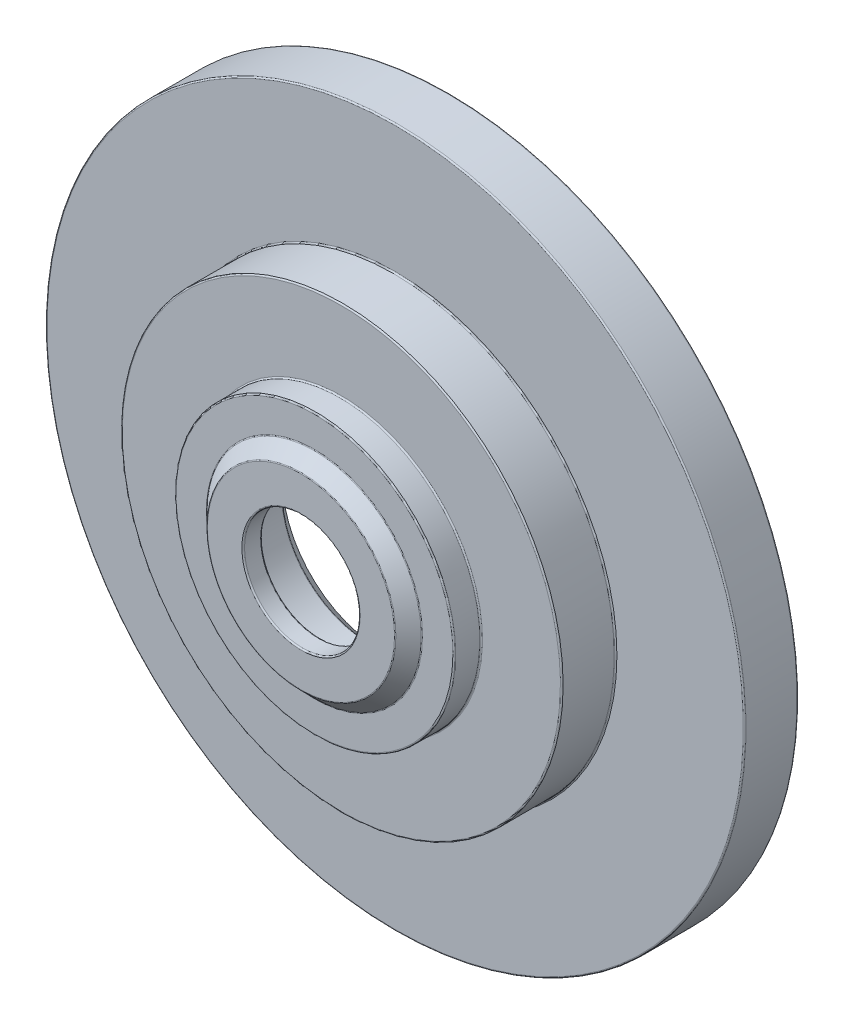
ISO-10303-21;
HEADER;
FILE_DESCRIPTION(('STEP AP214'),'2;1');
FILE_NAME('part.step','',(''),(''),'','','');
FILE_SCHEMA(('AUTOMOTIVE_DESIGN { 1 0 10303 214 1 1 1 1 }'));
ENDSEC;
DATA;
#1=APPLICATION_CONTEXT('core data for automotive mechanical design processes');
#2=APPLICATION_PROTOCOL_DEFINITION('international standard','automotive_design',2000,#1);
#3=PRODUCT_CONTEXT('',#1,'mechanical');
#4=PRODUCT('Part','Part','',(#3));
#5=PRODUCT_RELATED_PRODUCT_CATEGORY('part','',(#4));
#6=PRODUCT_DEFINITION_FORMATION('','',#4);
#7=PRODUCT_DEFINITION_CONTEXT('part definition',#1,'design');
#8=PRODUCT_DEFINITION('design','',#6,#7);
#9=PRODUCT_DEFINITION_SHAPE('','',#8);
#10=(LENGTH_UNIT() NAMED_UNIT(*) SI_UNIT(.MILLI.,.METRE.));
#11=(NAMED_UNIT(*) PLANE_ANGLE_UNIT() SI_UNIT($,.RADIAN.));
#12=(NAMED_UNIT(*) SI_UNIT($,.STERADIAN.) SOLID_ANGLE_UNIT());
#13=UNCERTAINTY_MEASURE_WITH_UNIT(LENGTH_MEASURE(1.E-05),#10,'distance_accuracy_value','');
#14=(GEOMETRIC_REPRESENTATION_CONTEXT(3) GLOBAL_UNCERTAINTY_ASSIGNED_CONTEXT((#13)) GLOBAL_UNIT_ASSIGNED_CONTEXT((#10,
#11,#12)) REPRESENTATION_CONTEXT('',''));
#15=CARTESIAN_POINT('',(0.,0.,0.));
#16=DIRECTION('',(0.,0.,1.));
#17=DIRECTION('',(1.,0.,0.));
#18=AXIS2_PLACEMENT_3D('',#15,#16,#17);
#19=CARTESIAN_POINT('',(0.,0.,-15.));
#20=DIRECTION('',(0.,0.,1.));
#21=DIRECTION('',(1.,0.,0.));
#22=AXIS2_PLACEMENT_3D('',#19,#20,#21);
#23=CYLINDRICAL_SURFACE('',#22,13.75);
#24=CARTESIAN_POINT('',(0.,0.,8.75));
#25=DIRECTION('',(0.,0.,1.));
#26=DIRECTION('',(1.,0.,0.));
#27=AXIS2_PLACEMENT_3D('',#24,#25,#26);
#28=CIRCLE('',#27,13.75);
#29=CARTESIAN_POINT('',(13.75,0.,8.75));
#30=VERTEX_POINT('',#29);
#31=EDGE_CURVE('E66',#30,#30,#28,.T.);
#32=ORIENTED_EDGE('',*,*,#31,.T.);
#33=EDGE_LOOP('',(#32));
#34=FACE_BOUND('',#33,.T.);
#35=CARTESIAN_POINT('',(0.,0.,7.25));
#36=DIRECTION('',(0.,0.,1.));
#37=DIRECTION('',(1.,0.,0.));
#38=AXIS2_PLACEMENT_3D('',#35,#36,#37);
#39=CIRCLE('',#38,13.75);
#40=CARTESIAN_POINT('',(13.75,0.,7.25));
#41=VERTEX_POINT('',#40);
#42=EDGE_CURVE('E69',#41,#41,#39,.F.);
#43=ORIENTED_EDGE('',*,*,#42,.T.);
#44=EDGE_LOOP('',(#43));
#45=FACE_BOUND('',#44,.T.);
#46=ADVANCED_FACE('F43',(#34,#45),#23,.F.);
#47=CARTESIAN_POINT('',(0.,0.,10.));
#48=DIRECTION('',(0.,0.,-1.));
#49=DIRECTION('',(-1.,0.,0.));
#50=AXIS2_PLACEMENT_3D('',#47,#48,#49);
#51=CYLINDRICAL_SURFACE('',#50,16.);
#52=CARTESIAN_POINT('',(0.,0.,6.75));
#53=DIRECTION('',(0.,0.,1.));
#54=DIRECTION('',(1.,0.,0.));
#55=AXIS2_PLACEMENT_3D('',#52,#53,#54);
#56=CIRCLE('',#55,16.);
#57=CARTESIAN_POINT('',(16.,0.,6.75));
#58=VERTEX_POINT('',#57);
#59=EDGE_CURVE('E103',#58,#58,#56,.T.);
#60=ORIENTED_EDGE('',*,*,#59,.T.);
#61=EDGE_LOOP('',(#60));
#62=FACE_BOUND('',#61,.T.);
#63=CARTESIAN_POINT('',(0.,0.,0.103553390593291));
#64=DIRECTION('',(0.,0.,1.));
#65=DIRECTION('',(1.,0.,0.));
#66=AXIS2_PLACEMENT_3D('',#63,#64,#65);
#67=CIRCLE('',#66,16.);
#68=CARTESIAN_POINT('',(16.,0.,0.103553390593291));
#69=VERTEX_POINT('',#68);
#70=EDGE_CURVE('E106',#69,#69,#67,.F.);
#71=ORIENTED_EDGE('',*,*,#70,.T.);
#72=EDGE_LOOP('',(#71));
#73=FACE_BOUND('',#72,.T.);
#74=ADVANCED_FACE('F204',(#62,#73),#51,.F.);
#75=CARTESIAN_POINT('',(0.,0.,10.));
#76=DIRECTION('',(0.,0.,1.));
#77=DIRECTION('',(1.,0.,0.));
#78=AXIS2_PLACEMENT_3D('',#75,#76,#77);
#79=PLANE('',#78);
#80=CARTESIAN_POINT('',(0.,0.,10.));
#81=DIRECTION('',(0.,0.,1.));
#82=DIRECTION('',(1.,0.,0.));
#83=AXIS2_PLACEMENT_3D('',#80,#81,#82);
#84=CIRCLE('',#83,20.1035533905932);
#85=CARTESIAN_POINT('',(20.1035533905932,0.,10.));
#86=VERTEX_POINT('',#85);
#87=EDGE_CURVE('E84',#86,#86,#84,.F.);
#88=ORIENTED_EDGE('',*,*,#87,.T.);
#89=EDGE_LOOP('',(#88));
#90=FACE_BOUND('',#89,.T.);
#91=CARTESIAN_POINT('',(0.,0.,10.));
#92=DIRECTION('',(0.,0.,1.));
#93=DIRECTION('',(1.,0.,0.));
#94=AXIS2_PLACEMENT_3D('',#91,#92,#93);
#95=CIRCLE('',#94,25.75);
#96=CARTESIAN_POINT('',(25.75,0.,10.));
#97=VERTEX_POINT('',#96);
#98=EDGE_CURVE('E112',#97,#97,#95,.T.);
#99=ORIENTED_EDGE('',*,*,#98,.T.);
#100=EDGE_LOOP('',(#99));
#101=FACE_BOUND('',#100,.T.);
#102=ADVANCED_FACE('F211',(#90,#101),#79,.T.);
#103=CARTESIAN_POINT('',(0.,0.,10.));
#104=DIRECTION('',(0.,0.,-1.));
#105=DIRECTION('',(-1.,0.,0.));
#106=AXIS2_PLACEMENT_3D('',#103,#104,#105);
#107=CYLINDRICAL_SURFACE('',#106,26.);
#108=CARTESIAN_POINT('',(0.,0.,5.24999999999817));
#109=DIRECTION('',(0.,0.,1.));
#110=DIRECTION('',(0.,-1.,0.));
#111=AXIS2_PLACEMENT_3D('',#108,#109,#110);
#112=CIRCLE('',#111,26.);
#113=CARTESIAN_POINT('',(0.,-26.,5.24999999999817));
#114=VERTEX_POINT('',#113);
#115=EDGE_CURVE('E115',#114,#114,#112,.T.);
#116=ORIENTED_EDGE('',*,*,#115,.T.);
#117=EDGE_LOOP('',(#116));
#118=FACE_BOUND('',#117,.T.);
#119=CARTESIAN_POINT('',(0.,0.,9.75));
#120=DIRECTION('',(0.,0.,1.));
#121=DIRECTION('',(1.,0.,0.));
#122=AXIS2_PLACEMENT_3D('',#119,#120,#121);
#123=CIRCLE('',#122,26.);
#124=CARTESIAN_POINT('',(26.,0.,9.75));
#125=VERTEX_POINT('',#124);
#126=EDGE_CURVE('E118',#125,#125,#123,.F.);
#127=ORIENTED_EDGE('',*,*,#126,.T.);
#128=EDGE_LOOP('',(#127));
#129=FACE_BOUND('',#128,.T.);
#130=ADVANCED_FACE('F255',(#118,#129),#107,.T.);
#131=CARTESIAN_POINT('',(0.,0.,7.));
#132=DIRECTION('',(0.,0.,1.));
#133=DIRECTION('',(1.,0.,0.));
#134=AXIS2_PLACEMENT_3D('',#131,#132,#133);
#135=PLANE('',#134);
#136=CARTESIAN_POINT('',(0.,0.,7.));
#137=DIRECTION('',(0.,0.,1.));
#138=DIRECTION('',(1.,0.,0.));
#139=AXIS2_PLACEMENT_3D('',#136,#137,#138);
#140=CIRCLE('',#139,14.);
#141=CARTESIAN_POINT('',(14.,0.,7.));
#142=VERTEX_POINT('',#141);
#143=EDGE_CURVE('E63',#142,#142,#140,.T.);
#144=ORIENTED_EDGE('',*,*,#143,.T.);
#145=EDGE_LOOP('',(#144));
#146=FACE_BOUND('',#145,.T.);
#147=CARTESIAN_POINT('',(0.,0.,7.));
#148=DIRECTION('',(0.,0.,1.));
#149=DIRECTION('',(1.,0.,0.));
#150=AXIS2_PLACEMENT_3D('',#147,#148,#149);
#151=CIRCLE('',#150,15.75);
#152=CARTESIAN_POINT('',(15.75,0.,7.));
#153=VERTEX_POINT('',#152);
#154=EDGE_CURVE('E109',#153,#153,#151,.F.);
#155=ORIENTED_EDGE('',*,*,#154,.T.);
#156=EDGE_LOOP('',(#155));
#157=FACE_BOUND('',#156,.T.);
#158=ADVANCED_FACE('F252',(#146,#157),#135,.F.);
#159=CARTESIAN_POINT('',(-1.02680314218504E-12,-2.50448979740572E-13,-113.499999999998));
#160=DIRECTION('',(0.,0.,-1.));
#161=DIRECTION('',(0.,1.,0.));
#162=AXIS2_PLACEMENT_3D('',#159,#160,#161);
#163=CYLINDRICAL_SURFACE('',#162,36.25);
#164=CARTESIAN_POINT('',(-1.0205280804424E-12,-2.28147157703187E-13,-14.2500000000018));
#165=DIRECTION('',(0.,0.,-1.));
#166=DIRECTION('',(0.,1.,0.));
#167=AXIS2_PLACEMENT_3D('',#164,#165,#166);
#168=CIRCLE('',#167,36.25);
#169=CARTESIAN_POINT('',(-1.0205280804424E-12,36.2499999999997,-14.2500000000019));
#170=VERTEX_POINT('',#169);
#171=EDGE_CURVE('E121',#170,#170,#168,.T.);
#172=ORIENTED_EDGE('',*,*,#171,.T.);
#173=EDGE_LOOP('',(#172));
#174=FACE_BOUND('',#173,.T.);
#175=CARTESIAN_POINT('',(-1.02008550681823E-12,-2.26574233226998E-13,-7.25000000000001));
#176=DIRECTION('',(0.,0.,-1.));
#177=DIRECTION('',(-1.,0.,0.));
#178=AXIS2_PLACEMENT_3D('',#175,#176,#177);
#179=CIRCLE('',#178,36.25);
#180=CARTESIAN_POINT('',(-36.250000000001,-2.26574233226998E-13,-7.25000000000001));
#181=VERTEX_POINT('',#180);
#182=EDGE_CURVE('E124',#181,#181,#179,.F.);
#183=ORIENTED_EDGE('',*,*,#182,.T.);
#184=EDGE_LOOP('',(#183));
#185=FACE_BOUND('',#184,.T.);
#186=ADVANCED_FACE('F248',(#174,#185),#163,.F.);
#187=CARTESIAN_POINT('',(-9.81840476387794,-34.8950057729282,-14.5000000000018));
#188=DIRECTION('',(0.,0.,-1.));
#189=DIRECTION('',(0.,1.,0.));
#190=AXIS2_PLACEMENT_3D('',#187,#188,#189);
#191=PLANE('',#190);
#192=CARTESIAN_POINT('',(-1.02054388664326E-12,-2.28203333577336E-13,-14.5000000000018));
#193=DIRECTION('',(0.,0.,-1.));
#194=DIRECTION('',(0.,1.,0.));
#195=AXIS2_PLACEMENT_3D('',#192,#193,#194);
#196=CIRCLE('',#195,47.25);
#197=CARTESIAN_POINT('',(-1.02054388664326E-12,47.2499999999997,-14.5000000000018));
#198=VERTEX_POINT('',#197);
#199=EDGE_CURVE('E127',#198,#198,#196,.T.);
#200=ORIENTED_EDGE('',*,*,#199,.T.);
#201=EDGE_LOOP('',(#200));
#202=FACE_BOUND('',#201,.T.);
#203=CARTESIAN_POINT('',(-1.02054388664326E-12,-2.28203333577336E-13,-14.5000000000018));
#204=DIRECTION('',(0.,0.,-1.));
#205=DIRECTION('',(0.,1.,0.));
#206=AXIS2_PLACEMENT_3D('',#203,#204,#205);
#207=CIRCLE('',#206,36.5);
#208=CARTESIAN_POINT('',(-1.02054388664326E-12,36.4999999999998,-14.5000000000018));
#209=VERTEX_POINT('',#208);
#210=EDGE_CURVE('E130',#209,#209,#207,.F.);
#211=ORIENTED_EDGE('',*,*,#210,.T.);
#212=EDGE_LOOP('',(#211));
#213=FACE_BOUND('',#212,.T.);
#214=ADVANCED_FACE('F244',(#202,#213),#191,.T.);
#215=CARTESIAN_POINT('',(-17.6054154386769,-62.5703551790435,-15.));
#216=DIRECTION('',(0.,0.,1.));
#217=DIRECTION('',(0.,-1.,0.));
#218=AXIS2_PLACEMENT_3D('',#215,#216,#217);
#219=PLANE('',#218);
#220=CARTESIAN_POINT('',(-1.02057549904499E-12,-2.28315685325635E-13,-15.));
#221=DIRECTION('',(0.,0.,1.));
#222=DIRECTION('',(0.,-1.,0.));
#223=AXIS2_PLACEMENT_3D('',#220,#221,#222);
#224=CIRCLE('',#223,64.75);
#225=CARTESIAN_POINT('',(-1.02057549904499E-12,-64.7500000000002,-15.));
#226=VERTEX_POINT('',#225);
#227=EDGE_CURVE('E133',#226,#226,#224,.F.);
#228=ORIENTED_EDGE('',*,*,#227,.T.);
#229=EDGE_LOOP('',(#228));
#230=FACE_BOUND('',#229,.T.);
#231=CARTESIAN_POINT('',(-1.02057549904499E-12,-2.28315685325635E-13,-15.));
#232=DIRECTION('',(0.,0.,1.));
#233=DIRECTION('',(0.,-1.,0.));
#234=AXIS2_PLACEMENT_3D('',#231,#232,#233);
#235=CIRCLE('',#234,47.75);
#236=CARTESIAN_POINT('',(-1.02057549904499E-12,-47.7500000000002,-15.));
#237=VERTEX_POINT('',#236);
#238=EDGE_CURVE('E136',#237,#237,#235,.T.);
#239=ORIENTED_EDGE('',*,*,#238,.T.);
#240=EDGE_LOOP('',(#239));
#241=FACE_BOUND('',#240,.T.);
#242=ADVANCED_FACE('F240',(#230,#241),#219,.F.);
#243=CARTESIAN_POINT('',(-1.02680314218504E-12,-2.50448979740572E-13,-113.499999999998));
#244=DIRECTION('',(0.,0.,-1.));
#245=DIRECTION('',(0.,1.,0.));
#246=AXIS2_PLACEMENT_3D('',#243,#244,#245);
#247=CYLINDRICAL_SURFACE('',#246,65.);
#248=CARTESIAN_POINT('',(-1.01995905721133E-12,-2.26124826233801E-13,-5.25000000000005));
#249=DIRECTION('',(0.,0.,-1.));
#250=DIRECTION('',(0.,1.,0.));
#251=AXIS2_PLACEMENT_3D('',#248,#249,#250);
#252=CIRCLE('',#251,65.);
#253=CARTESIAN_POINT('',(-1.01995905721133E-12,64.9999999999998,-5.25000000000006));
#254=VERTEX_POINT('',#253);
#255=EDGE_CURVE('E139',#254,#254,#252,.T.);
#256=ORIENTED_EDGE('',*,*,#255,.T.);
#257=EDGE_LOOP('',(#256));
#258=FACE_BOUND('',#257,.T.);
#259=CARTESIAN_POINT('',(-1.02055969284412E-12,-2.28259509451485E-13,-14.75));
#260=DIRECTION('',(0.,0.,1.));
#261=DIRECTION('',(0.,-1.,0.));
#262=AXIS2_PLACEMENT_3D('',#259,#260,#261);
#263=CIRCLE('',#262,65.);
#264=CARTESIAN_POINT('',(-1.02055969284412E-12,-65.0000000000002,-14.75));
#265=VERTEX_POINT('',#264);
#266=EDGE_CURVE('E142',#265,#265,#263,.T.);
#267=ORIENTED_EDGE('',*,*,#266,.T.);
#268=EDGE_LOOP('',(#267));
#269=FACE_BOUND('',#268,.T.);
#270=ADVANCED_FACE('F236',(#258,#269),#247,.T.);
#271=CARTESIAN_POINT('',(-11.1049543536275,-39.4674548052435,-5.00000000000003));
#272=DIRECTION('',(0.,0.,-1.));
#273=DIRECTION('',(0.,1.,0.));
#274=AXIS2_PLACEMENT_3D('',#271,#272,#273);
#275=PLANE('',#274);
#276=CARTESIAN_POINT('',(-1.01994325101046E-12,-2.26068650359651E-13,-5.00000000000004));
#277=DIRECTION('',(0.,0.,-1.));
#278=DIRECTION('',(0.,1.,0.));
#279=AXIS2_PLACEMENT_3D('',#276,#277,#278);
#280=CIRCLE('',#279,41.2500000000004);
#281=CARTESIAN_POINT('',(-1.01994325101046E-12,41.2500000000002,-5.00000000000005));
#282=VERTEX_POINT('',#281);
#283=EDGE_CURVE('E145',#282,#282,#280,.T.);
#284=ORIENTED_EDGE('',*,*,#283,.T.);
#285=EDGE_LOOP('',(#284));
#286=FACE_BOUND('',#285,.T.);
#287=CARTESIAN_POINT('',(-1.01994325101046E-12,-2.26068650359651E-13,-5.00000000000004));
#288=DIRECTION('',(0.,0.,-1.));
#289=DIRECTION('',(0.,1.,0.));
#290=AXIS2_PLACEMENT_3D('',#287,#288,#289);
#291=CIRCLE('',#290,64.75);
#292=CARTESIAN_POINT('',(-1.01994325101046E-12,64.7499999999998,-5.00000000000006));
#293=VERTEX_POINT('',#292);
#294=EDGE_CURVE('E148',#293,#293,#291,.F.);
#295=ORIENTED_EDGE('',*,*,#294,.T.);
#296=EDGE_LOOP('',(#295));
#297=FACE_BOUND('',#296,.T.);
#298=ADVANCED_FACE('F232',(#286,#297),#275,.F.);
#299=CARTESIAN_POINT('',(-1.02680314218504E-12,-2.50448979740572E-13,-113.499999999998));
#300=DIRECTION('',(0.,0.,-1.));
#301=DIRECTION('',(0.,1.,0.));
#302=AXIS2_PLACEMENT_3D('',#299,#300,#301);
#303=CYLINDRICAL_SURFACE('',#302,41.0000000000004);
#304=CARTESIAN_POINT('',(-1.0193268091768E-12,-2.23877791267818E-13,4.74999999999817));
#305=DIRECTION('',(0.,0.,1.));
#306=DIRECTION('',(0.,-1.,0.));
#307=AXIS2_PLACEMENT_3D('',#304,#305,#306);
#308=CIRCLE('',#307,41.0000000000004);
#309=CARTESIAN_POINT('',(-1.0193268091768E-12,-41.0000000000006,4.74999999999818));
#310=VERTEX_POINT('',#309);
#311=EDGE_CURVE('E157',#310,#310,#308,.F.);
#312=ORIENTED_EDGE('',*,*,#311,.T.);
#313=EDGE_LOOP('',(#312));
#314=FACE_BOUND('',#313,.T.);
#315=CARTESIAN_POINT('',(-1.0199274448096E-12,-2.26012474485502E-13,-4.75000000000005));
#316=DIRECTION('',(0.,0.,-1.));
#317=DIRECTION('',(0.,1.,0.));
#318=AXIS2_PLACEMENT_3D('',#315,#316,#317);
#319=CIRCLE('',#318,41.0000000000004);
#320=CARTESIAN_POINT('',(-1.0199274448096E-12,41.0000000000002,-4.75000000000006));
#321=VERTEX_POINT('',#320);
#322=EDGE_CURVE('E160',#321,#321,#319,.F.);
#323=ORIENTED_EDGE('',*,*,#322,.T.);
#324=EDGE_LOOP('',(#323));
#325=FACE_BOUND('',#324,.T.);
#326=ADVANCED_FACE('F228',(#314,#325),#303,.T.);
#327=CARTESIAN_POINT('',(-7.04216617547144,-25.0281420716178,4.99999999999817));
#328=DIRECTION('',(0.,0.,1.));
#329=DIRECTION('',(0.,-1.,0.));
#330=AXIS2_PLACEMENT_3D('',#327,#328,#329);
#331=PLANE('',#330);
#332=CARTESIAN_POINT('',(-1.01931100297594E-12,-2.23821615393668E-13,4.99999999999817));
#333=DIRECTION('',(0.,0.,1.));
#334=DIRECTION('',(0.,-1.,0.));
#335=AXIS2_PLACEMENT_3D('',#332,#333,#334);
#336=CIRCLE('',#335,40.7500000000004);
#337=CARTESIAN_POINT('',(-1.01931100297594E-12,-40.7500000000006,4.99999999999817));
#338=VERTEX_POINT('',#337);
#339=EDGE_CURVE('E151',#338,#338,#336,.T.);
#340=ORIENTED_EDGE('',*,*,#339,.T.);
#341=EDGE_LOOP('',(#340));
#342=FACE_BOUND('',#341,.T.);
#343=CARTESIAN_POINT('',(0.,0.,4.99999999999817));
#344=DIRECTION('',(0.,0.,1.));
#345=DIRECTION('',(0.,-1.,0.));
#346=AXIS2_PLACEMENT_3D('',#343,#344,#345);
#347=CIRCLE('',#346,26.25);
#348=CARTESIAN_POINT('',(0.,-26.25,4.99999999999817));
#349=VERTEX_POINT('',#348);
#350=EDGE_CURVE('E154',#349,#349,#347,.F.);
#351=ORIENTED_EDGE('',*,*,#350,.T.);
#352=EDGE_LOOP('',(#351));
#353=FACE_BOUND('',#352,.T.);
#354=ADVANCED_FACE('F224',(#342,#353),#331,.T.);
#355=CARTESIAN_POINT('',(-1.0196271269932E-12,-2.2494513287666E-13,-7.));
#356=DIRECTION('',(0.,0.,-1.));
#357=DIRECTION('',(-1.,0.,0.));
#358=AXIS2_PLACEMENT_3D('',#355,#356,#357);
#359=PLANE('',#358);
#360=CARTESIAN_POINT('',(-1.0196271269932E-12,-2.2494513287666E-13,-7.));
#361=DIRECTION('',(0.,0.,-1.));
#362=DIRECTION('',(-1.,0.,0.));
#363=AXIS2_PLACEMENT_3D('',#360,#361,#362);
#364=CIRCLE('',#363,26.4999999999991);
#365=CARTESIAN_POINT('',(-26.5000000000002,-2.2494513287666E-13,-7.));
#366=VERTEX_POINT('',#365);
#367=EDGE_CURVE('E163',#366,#366,#364,.F.);
#368=ORIENTED_EDGE('',*,*,#367,.T.);
#369=EDGE_LOOP('',(#368));
#370=FACE_BOUND('',#369,.T.);
#371=CARTESIAN_POINT('',(-1.02008550681823E-12,-2.26574233226998E-13,-7.));
#372=DIRECTION('',(0.,0.,-1.));
#373=DIRECTION('',(-1.,0.,0.));
#374=AXIS2_PLACEMENT_3D('',#371,#372,#373);
#375=CIRCLE('',#374,36.);
#376=CARTESIAN_POINT('',(-36.000000000001,-2.26574233226998E-13,-7.));
#377=VERTEX_POINT('',#376);
#378=EDGE_CURVE('E166',#377,#377,#375,.T.);
#379=ORIENTED_EDGE('',*,*,#378,.T.);
#380=EDGE_LOOP('',(#379));
#381=FACE_BOUND('',#380,.T.);
#382=ADVANCED_FACE('F220',(#370,#381),#359,.T.);
#383=CARTESIAN_POINT('',(-1.0196271269932E-12,-2.2494513287666E-13,-7.));
#384=DIRECTION('',(0.,0.,1.));
#385=DIRECTION('',(1.,0.,0.));
#386=AXIS2_PLACEMENT_3D('',#383,#384,#385);
#387=CYLINDRICAL_SURFACE('',#386,26.2499999999991);
#388=CARTESIAN_POINT('',(-1.0196271269932E-12,-2.2494513287666E-13,-6.75));
#389=DIRECTION('',(0.,0.,-1.));
#390=DIRECTION('',(-1.,0.,0.));
#391=AXIS2_PLACEMENT_3D('',#388,#389,#390);
#392=CIRCLE('',#391,26.2499999999991);
#393=CARTESIAN_POINT('',(26.2499999999981,-2.2494513287666E-13,-6.75));
#394=VERTEX_POINT('',#393);
#395=EDGE_CURVE('E169',#394,#394,#392,.T.);
#396=CARTESIAN_POINT('',(-1.0196271269932E-12,-2.2494513287666E-13,-2.75));
#397=DIRECTION('',(0.,0.,-1.));
#398=DIRECTION('',(-1.,0.,0.));
#399=AXIS2_PLACEMENT_3D('',#396,#397,#398);
#400=CIRCLE('',#399,26.2499999999991);
#401=CARTESIAN_POINT('',(26.2499999999981,-2.2494513287666E-13,-2.75));
#402=VERTEX_POINT('',#401);
#403=EDGE_CURVE('E91',#402,#402,#400,.F.);
#404=CARTESIAN_POINT('',(26.2499999999981,-2.2494513287666E-13,-6.75));
#405=CARTESIAN_POINT('',(26.2499999999981,-2.2494513287666E-13,-6.70833333333333));
#406=CARTESIAN_POINT('',(26.2499999999981,-2.2494513287666E-13,-6.66666666666667));
#407=CARTESIAN_POINT('',(26.2499999999981,-2.2494513287666E-13,-6.58333333333333));
#408=CARTESIAN_POINT('',(26.2499999999981,-2.2494513287666E-13,-6.54166666666667));
#409=CARTESIAN_POINT('',(26.2499999999981,-2.2494513287666E-13,-6.45833333333333));
#410=CARTESIAN_POINT('',(26.2499999999981,-2.2494513287666E-13,-6.41666666666667));
#411=CARTESIAN_POINT('',(26.2499999999981,-2.2494513287666E-13,-6.33333333333333));
#412=CARTESIAN_POINT('',(26.2499999999981,-2.2494513287666E-13,-6.29166666666667));
#413=CARTESIAN_POINT('',(26.2499999999981,-2.2494513287666E-13,-6.20833333333333));
#414=CARTESIAN_POINT('',(26.2499999999981,-2.2494513287666E-13,-6.16666666666667));
#415=CARTESIAN_POINT('',(26.2499999999981,-2.2494513287666E-13,-6.08333333333333));
#416=CARTESIAN_POINT('',(26.2499999999981,-2.2494513287666E-13,-6.04166666666667));
#417=CARTESIAN_POINT('',(26.2499999999981,-2.2494513287666E-13,-5.95833333333333));
#418=CARTESIAN_POINT('',(26.2499999999981,-2.2494513287666E-13,-5.91666666666667));
#419=CARTESIAN_POINT('',(26.2499999999981,-2.2494513287666E-13,-5.83333333333333));
#420=CARTESIAN_POINT('',(26.2499999999981,-2.2494513287666E-13,-5.79166666666667));
#421=CARTESIAN_POINT('',(26.2499999999981,-2.2494513287666E-13,-5.70833333333333));
#422=CARTESIAN_POINT('',(26.2499999999981,-2.2494513287666E-13,-5.66666666666667));
#423=CARTESIAN_POINT('',(26.2499999999981,-2.2494513287666E-13,-5.58333333333333));
#424=CARTESIAN_POINT('',(26.2499999999981,-2.2494513287666E-13,-5.54166666666667));
#425=CARTESIAN_POINT('',(26.2499999999981,-2.2494513287666E-13,-5.45833333333333));
#426=CARTESIAN_POINT('',(26.2499999999981,-2.2494513287666E-13,-5.41666666666667));
#427=CARTESIAN_POINT('',(26.2499999999981,-2.2494513287666E-13,-5.33333333333333));
#428=CARTESIAN_POINT('',(26.2499999999981,-2.2494513287666E-13,-5.29166666666667));
#429=CARTESIAN_POINT('',(26.2499999999981,-2.2494513287666E-13,-5.20833333333333));
#430=CARTESIAN_POINT('',(26.2499999999981,-2.2494513287666E-13,-5.16666666666667));
#431=CARTESIAN_POINT('',(26.2499999999981,-2.2494513287666E-13,-5.08333333333333));
#432=CARTESIAN_POINT('',(26.2499999999981,-2.2494513287666E-13,-5.04166666666667));
#433=CARTESIAN_POINT('',(26.2499999999981,-2.2494513287666E-13,-4.95833333333333));
#434=CARTESIAN_POINT('',(26.2499999999981,-2.2494513287666E-13,-4.91666666666667));
#435=CARTESIAN_POINT('',(26.2499999999981,-2.2494513287666E-13,-4.83333333333333));
#436=CARTESIAN_POINT('',(26.2499999999981,-2.2494513287666E-13,-4.79166666666667));
#437=CARTESIAN_POINT('',(26.2499999999981,-2.2494513287666E-13,-4.70833333333333));
#438=CARTESIAN_POINT('',(26.2499999999981,-2.2494513287666E-13,-4.66666666666667));
#439=CARTESIAN_POINT('',(26.2499999999981,-2.2494513287666E-13,-4.58333333333333));
#440=CARTESIAN_POINT('',(26.2499999999981,-2.2494513287666E-13,-4.54166666666667));
#441=CARTESIAN_POINT('',(26.2499999999981,-2.2494513287666E-13,-4.45833333333333));
#442=CARTESIAN_POINT('',(26.2499999999981,-2.2494513287666E-13,-4.41666666666667));
#443=CARTESIAN_POINT('',(26.2499999999981,-2.2494513287666E-13,-4.33333333333333));
#444=CARTESIAN_POINT('',(26.2499999999981,-2.2494513287666E-13,-4.29166666666667));
#445=CARTESIAN_POINT('',(26.2499999999981,-2.2494513287666E-13,-4.20833333333333));
#446=CARTESIAN_POINT('',(26.2499999999981,-2.2494513287666E-13,-4.16666666666667));
#447=CARTESIAN_POINT('',(26.2499999999981,-2.2494513287666E-13,-4.08333333333333));
#448=CARTESIAN_POINT('',(26.2499999999981,-2.2494513287666E-13,-4.04166666666667));
#449=CARTESIAN_POINT('',(26.2499999999981,-2.2494513287666E-13,-3.95833333333333));
#450=CARTESIAN_POINT('',(26.2499999999981,-2.2494513287666E-13,-3.91666666666667));
#451=CARTESIAN_POINT('',(26.2499999999981,-2.2494513287666E-13,-3.83333333333333));
#452=CARTESIAN_POINT('',(26.2499999999981,-2.2494513287666E-13,-3.79166666666667));
#453=CARTESIAN_POINT('',(26.2499999999981,-2.2494513287666E-13,-3.70833333333333));
#454=CARTESIAN_POINT('',(26.2499999999981,-2.2494513287666E-13,-3.66666666666667));
#455=CARTESIAN_POINT('',(26.2499999999981,-2.2494513287666E-13,-3.58333333333333));
#456=CARTESIAN_POINT('',(26.2499999999981,-2.2494513287666E-13,-3.54166666666667));
#457=CARTESIAN_POINT('',(26.2499999999981,-2.2494513287666E-13,-3.45833333333333));
#458=CARTESIAN_POINT('',(26.2499999999981,-2.2494513287666E-13,-3.41666666666667));
#459=CARTESIAN_POINT('',(26.2499999999981,-2.2494513287666E-13,-3.33333333333333));
#460=CARTESIAN_POINT('',(26.2499999999981,-2.2494513287666E-13,-3.29166666666667));
#461=CARTESIAN_POINT('',(26.2499999999981,-2.2494513287666E-13,-3.20833333333333));
#462=CARTESIAN_POINT('',(26.2499999999981,-2.2494513287666E-13,-3.16666666666667));
#463=CARTESIAN_POINT('',(26.2499999999981,-2.2494513287666E-13,-3.08333333333333));
#464=CARTESIAN_POINT('',(26.2499999999981,-2.2494513287666E-13,-3.04166666666667));
#465=CARTESIAN_POINT('',(26.2499999999981,-2.2494513287666E-13,-2.95833333333333));
#466=CARTESIAN_POINT('',(26.2499999999981,-2.2494513287666E-13,-2.91666666666667));
#467=CARTESIAN_POINT('',(26.2499999999981,-2.2494513287666E-13,-2.83333333333333));
#468=CARTESIAN_POINT('',(26.2499999999981,-2.2494513287666E-13,-2.79166666666667));
#469=CARTESIAN_POINT('',(26.2499999999981,-2.2494513287666E-13,-2.75));
#470=B_SPLINE_CURVE_WITH_KNOTS('',3,(#404,#405,#406,#407,#408,#409,#410,#411,#412,#413,#414,
#415,#416,#417,#418,#419,#420,#421,#422,#423,#424,#425,#426,#427,#428,#429,#430,#431,#432,#433,
#434,#435,#436,#437,#438,#439,#440,#441,#442,#443,#444,#445,#446,#447,#448,#449,#450,#451,#452,
#453,#454,#455,#456,#457,#458,#459,#460,#461,#462,#463,#464,#465,#466,#467,#468,#469),
.UNSPECIFIED.,.F.,.F.,(4,2,2,2,2,2,2,2,2,2,2,2,2,2,2,2,2,2,2,2,2,2,2,2,2,2,2,2,2,2,2,2,4),(0.,
0.124999999999999,0.249999999999999,0.374999999999999,0.5,0.625,0.749999999999999,
0.874999999999999,0.999999999999999,1.125,1.25,1.375,1.5,1.625,1.75,1.875,2.,2.125,2.25,2.375,
2.5,2.625,2.75,2.875,3.,3.125,3.25,3.375,3.5,3.625,3.75,3.875,4.),.UNSPECIFIED.);
#471=EDGE_CURVE('BSEAM175',#394,#402,#470,.T.);
#472=ORIENTED_EDGE('',*,*,#395,.T.);
#473=ORIENTED_EDGE('',*,*,#403,.T.);
#474=ORIENTED_EDGE('',*,*,#471,.T.);
#475=ORIENTED_EDGE('',*,*,#471,.F.);
#476=EDGE_LOOP('',(#472,#474,#473,#475));
#477=FACE_BOUND('',#476,.T.);
#478=ADVANCED_FACE('F175',(#477),#387,.F.);
#479=CARTESIAN_POINT('',(0.,0.,-2.5));
#480=DIRECTION('',(0.,0.,-1.));
#481=DIRECTION('',(-1.,0.,0.));
#482=AXIS2_PLACEMENT_3D('',#479,#480,#481);
#483=PLANE('',#482);
#484=CARTESIAN_POINT('',(-1.0196271269932E-12,-2.2494513287666E-13,-2.5));
#485=DIRECTION('',(0.,0.,-1.));
#486=DIRECTION('',(-1.,0.,0.));
#487=AXIS2_PLACEMENT_3D('',#484,#485,#486);
#488=CIRCLE('',#487,25.9999999999991);
#489=CARTESIAN_POINT('',(-26.0000000000002,-2.2494513287666E-13,-2.5));
#490=VERTEX_POINT('',#489);
#491=EDGE_CURVE('E97',#490,#490,#488,.T.);
#492=ORIENTED_EDGE('',*,*,#491,.T.);
#493=EDGE_LOOP('',(#492));
#494=FACE_BOUND('',#493,.T.);
#495=CARTESIAN_POINT('',(0.,0.,-2.5));
#496=DIRECTION('',(0.,0.,-1.));
#497=DIRECTION('',(-1.,0.,0.));
#498=AXIS2_PLACEMENT_3D('',#495,#496,#497);
#499=CIRCLE('',#498,18.6035533905933);
#500=CARTESIAN_POINT('',(-18.6035533905933,0.,-2.5));
#501=VERTEX_POINT('',#500);
#502=EDGE_CURVE('E100',#501,#501,#499,.F.);
#503=ORIENTED_EDGE('',*,*,#502,.T.);
#504=EDGE_LOOP('',(#503));
#505=FACE_BOUND('',#504,.T.);
#506=ADVANCED_FACE('F185',(#494,#505),#483,.T.);
#507=CARTESIAN_POINT('',(0.,0.,-2.5));
#508=DIRECTION('',(0.,0.,-1.));
#509=DIRECTION('',(-1.,0.,0.));
#510=AXIS2_PLACEMENT_3D('',#507,#508,#509);
#511=CONICAL_SURFACE('',#510,18.5,0.785398163397448);
#512=CARTESIAN_POINT('',(0.,0.,-2.42677669529663));
#513=DIRECTION('',(0.,0.,1.));
#514=DIRECTION('',(1.,0.,0.));
#515=AXIS2_PLACEMENT_3D('',#512,#513,#514);
#516=CIRCLE('',#515,18.4267766952967);
#517=CARTESIAN_POINT('',(18.4267766952967,0.,-2.42677669529663));
#518=VERTEX_POINT('',#517);
#519=EDGE_CURVE('E87',#518,#518,#516,.F.);
#520=ORIENTED_EDGE('',*,*,#519,.T.);
#521=EDGE_LOOP('',(#520));
#522=FACE_BOUND('',#521,.T.);
#523=CARTESIAN_POINT('',(0.,0.,-0.0732233047033466));
#524=DIRECTION('',(0.,0.,1.));
#525=DIRECTION('',(1.,0.,0.));
#526=AXIS2_PLACEMENT_3D('',#523,#524,#525);
#527=CIRCLE('',#526,16.0732233047034);
#528=CARTESIAN_POINT('',(16.0732233047034,0.,-0.0732233047033466));
#529=VERTEX_POINT('',#528);
#530=EDGE_CURVE('E94',#529,#529,#527,.T.);
#531=ORIENTED_EDGE('',*,*,#530,.T.);
#532=EDGE_LOOP('',(#531));
#533=FACE_BOUND('',#532,.T.);
#534=ADVANCED_FACE('F188',(#522,#533),#511,.F.);
#535=CARTESIAN_POINT('',(-1.0196271269932E-12,-2.2494513287666E-13,-6.75));
#536=DIRECTION('',(0.,0.,-1.));
#537=DIRECTION('',(-1.,0.,0.));
#538=AXIS2_PLACEMENT_3D('',#535,#536,#537);
#539=TOROIDAL_SURFACE('',#538,26.4999999999991,0.25);
#540=ORIENTED_EDGE('',*,*,#367,.F.);
#541=EDGE_LOOP('',(#540));
#542=FACE_BOUND('',#541,.T.);
#543=ORIENTED_EDGE('',*,*,#395,.F.);
#544=EDGE_LOOP('',(#543));
#545=FACE_BOUND('',#544,.T.);
#546=ADVANCED_FACE('F269',(#542,#545),#539,.T.);
#547=CARTESIAN_POINT('',(-1.0193268091768E-12,-2.23877791267818E-13,4.74999999999817));
#548=DIRECTION('',(0.,0.,1.));
#549=DIRECTION('',(0.,-1.,0.));
#550=AXIS2_PLACEMENT_3D('',#547,#548,#549);
#551=TOROIDAL_SURFACE('',#550,40.7500000000004,0.25);
#552=ORIENTED_EDGE('',*,*,#339,.F.);
#553=EDGE_LOOP('',(#552));
#554=FACE_BOUND('',#553,.T.);
#555=ORIENTED_EDGE('',*,*,#311,.F.);
#556=EDGE_LOOP('',(#555));
#557=FACE_BOUND('',#556,.T.);
#558=ADVANCED_FACE('F273',(#554,#557),#551,.T.);
#559=CARTESIAN_POINT('',(-1.0199274448096E-12,-2.26012474485502E-13,-4.75000000000005));
#560=DIRECTION('',(0.,0.,-1.));
#561=DIRECTION('',(0.,1.,0.));
#562=AXIS2_PLACEMENT_3D('',#559,#560,#561);
#563=TOROIDAL_SURFACE('',#562,41.2500000000004,0.25);
#564=ORIENTED_EDGE('',*,*,#322,.F.);
#565=EDGE_LOOP('',(#564));
#566=FACE_BOUND('',#565,.T.);
#567=ORIENTED_EDGE('',*,*,#283,.F.);
#568=EDGE_LOOP('',(#567));
#569=FACE_BOUND('',#568,.T.);
#570=ADVANCED_FACE('F277',(#566,#569),#563,.F.);
#571=CARTESIAN_POINT('',(-1.01995905721133E-12,-2.26124826233801E-13,-5.25000000000005));
#572=DIRECTION('',(0.,0.,-1.));
#573=DIRECTION('',(0.,1.,0.));
#574=AXIS2_PLACEMENT_3D('',#571,#572,#573);
#575=TOROIDAL_SURFACE('',#574,64.75,0.25);
#576=ORIENTED_EDGE('',*,*,#294,.F.);
#577=EDGE_LOOP('',(#576));
#578=FACE_BOUND('',#577,.T.);
#579=ORIENTED_EDGE('',*,*,#255,.F.);
#580=EDGE_LOOP('',(#579));
#581=FACE_BOUND('',#580,.T.);
#582=ADVANCED_FACE('F281',(#578,#581),#575,.T.);
#583=CARTESIAN_POINT('',(-1.02055969284412E-12,-2.28259509451485E-13,-14.75));
#584=DIRECTION('',(0.,0.,1.));
#585=DIRECTION('',(0.,-1.,0.));
#586=AXIS2_PLACEMENT_3D('',#583,#584,#585);
#587=TOROIDAL_SURFACE('',#586,64.75,0.25);
#588=ORIENTED_EDGE('',*,*,#266,.F.);
#589=EDGE_LOOP('',(#588));
#590=FACE_BOUND('',#589,.T.);
#591=ORIENTED_EDGE('',*,*,#227,.F.);
#592=EDGE_LOOP('',(#591));
#593=FACE_BOUND('',#592,.T.);
#594=ADVANCED_FACE('F285',(#590,#593),#587,.T.);
#595=CARTESIAN_POINT('',(-1.02055969284412E-12,-2.28259509451486E-13,-14.7500000000018));
#596=DIRECTION('',(0.,0.,-1.));
#597=DIRECTION('',(0.,1.,0.));
#598=AXIS2_PLACEMENT_3D('',#595,#596,#597);
#599=TOROIDAL_SURFACE('',#598,47.25,0.25);
#600=ORIENTED_EDGE('',*,*,#199,.F.);
#601=EDGE_LOOP('',(#600));
#602=FACE_BOUND('',#601,.T.);
#603=CARTESIAN_POINT('',(-1.02055969284412E-12,-2.28259509451486E-13,-14.7500000000018));
#604=DIRECTION('',(0.,0.,-1.));
#605=DIRECTION('',(0.,1.,0.));
#606=AXIS2_PLACEMENT_3D('',#603,#604,#605);
#607=CIRCLE('',#606,47.5);
#608=CARTESIAN_POINT('',(-1.02055969284412E-12,47.4999999999997,-14.7500000000019));
#609=VERTEX_POINT('',#608);
#610=EDGE_CURVE('E88',#609,#609,#607,.F.);
#611=ORIENTED_EDGE('',*,*,#610,.F.);
#612=EDGE_LOOP('',(#611));
#613=FACE_BOUND('',#612,.T.);
#614=ADVANCED_FACE('F289',(#602,#613),#599,.F.);
#615=CARTESIAN_POINT('',(-1.02055969284412E-12,-2.28259509451485E-13,-14.75));
#616=DIRECTION('',(0.,0.,1.));
#617=DIRECTION('',(0.,-1.,0.));
#618=AXIS2_PLACEMENT_3D('',#615,#616,#617);
#619=TOROIDAL_SURFACE('',#618,47.75,0.25);
#620=ORIENTED_EDGE('',*,*,#238,.F.);
#621=EDGE_LOOP('',(#620));
#622=FACE_BOUND('',#621,.T.);
#623=ORIENTED_EDGE('',*,*,#610,.T.);
#624=EDGE_LOOP('',(#623));
#625=FACE_BOUND('',#624,.T.);
#626=ADVANCED_FACE('F291',(#622,#625),#619,.T.);
#627=CARTESIAN_POINT('',(-1.0205280804424E-12,-2.28147157703187E-13,-14.2500000000018));
#628=DIRECTION('',(0.,0.,-1.));
#629=DIRECTION('',(0.,1.,0.));
#630=AXIS2_PLACEMENT_3D('',#627,#628,#629);
#631=TOROIDAL_SURFACE('',#630,36.5,0.25);
#632=ORIENTED_EDGE('',*,*,#210,.F.);
#633=EDGE_LOOP('',(#632));
#634=FACE_BOUND('',#633,.T.);
#635=ORIENTED_EDGE('',*,*,#171,.F.);
#636=EDGE_LOOP('',(#635));
#637=FACE_BOUND('',#636,.T.);
#638=ADVANCED_FACE('F294',(#634,#637),#631,.T.);
#639=CARTESIAN_POINT('',(0.,0.,5.24999999999817));
#640=DIRECTION('',(0.,0.,1.));
#641=DIRECTION('',(0.,-1.,0.));
#642=AXIS2_PLACEMENT_3D('',#639,#640,#641);
#643=TOROIDAL_SURFACE('',#642,26.25,0.25);
#644=ORIENTED_EDGE('',*,*,#350,.F.);
#645=EDGE_LOOP('',(#644));
#646=FACE_BOUND('',#645,.T.);
#647=ORIENTED_EDGE('',*,*,#115,.F.);
#648=EDGE_LOOP('',(#647));
#649=FACE_BOUND('',#648,.T.);
#650=ADVANCED_FACE('F301',(#646,#649),#643,.F.);
#651=CARTESIAN_POINT('',(0.,0.,6.75));
#652=DIRECTION('',(0.,0.,1.));
#653=DIRECTION('',(1.,0.,0.));
#654=AXIS2_PLACEMENT_3D('',#651,#652,#653);
#655=TOROIDAL_SURFACE('',#654,15.75,0.25);
#656=ORIENTED_EDGE('',*,*,#154,.F.);
#657=EDGE_LOOP('',(#656));
#658=FACE_BOUND('',#657,.T.);
#659=ORIENTED_EDGE('',*,*,#59,.F.);
#660=EDGE_LOOP('',(#659));
#661=FACE_BOUND('',#660,.T.);
#662=ADVANCED_FACE('F305',(#658,#661),#655,.F.);
#663=CARTESIAN_POINT('',(0.,0.,9.75));
#664=DIRECTION('',(0.,0.,1.));
#665=DIRECTION('',(1.,0.,0.));
#666=AXIS2_PLACEMENT_3D('',#663,#664,#665);
#667=TOROIDAL_SURFACE('',#666,25.75,0.25);
#668=ORIENTED_EDGE('',*,*,#126,.F.);
#669=EDGE_LOOP('',(#668));
#670=FACE_BOUND('',#669,.T.);
#671=ORIENTED_EDGE('',*,*,#98,.F.);
#672=EDGE_LOOP('',(#671));
#673=FACE_BOUND('',#672,.T.);
#674=ADVANCED_FACE('F309',(#670,#673),#667,.T.);
#675=CARTESIAN_POINT('',(-1.02008550681823E-12,-2.26574233226998E-13,-7.25000000000001));
#676=DIRECTION('',(0.,0.,-1.));
#677=DIRECTION('',(-1.,0.,0.));
#678=AXIS2_PLACEMENT_3D('',#675,#676,#677);
#679=TOROIDAL_SURFACE('',#678,36.,0.25);
#680=ORIENTED_EDGE('',*,*,#182,.F.);
#681=EDGE_LOOP('',(#680));
#682=FACE_BOUND('',#681,.T.);
#683=ORIENTED_EDGE('',*,*,#378,.F.);
#684=EDGE_LOOP('',(#683));
#685=FACE_BOUND('',#684,.T.);
#686=ADVANCED_FACE('F181',(#682,#685),#679,.F.);
#687=CARTESIAN_POINT('',(-1.0196271269932E-12,-2.2494513287666E-13,-2.75));
#688=DIRECTION('',(0.,0.,-1.));
#689=DIRECTION('',(-1.,0.,0.));
#690=AXIS2_PLACEMENT_3D('',#687,#688,#689);
#691=TOROIDAL_SURFACE('',#690,25.9999999999991,0.25);
#692=ORIENTED_EDGE('',*,*,#403,.F.);
#693=EDGE_LOOP('',(#692));
#694=FACE_BOUND('',#693,.T.);
#695=ORIENTED_EDGE('',*,*,#491,.F.);
#696=EDGE_LOOP('',(#695));
#697=FACE_BOUND('',#696,.T.);
#698=ADVANCED_FACE('F177',(#694,#697),#691,.F.);
#699=CARTESIAN_POINT('',(0.,0.,-2.25));
#700=DIRECTION('',(0.,0.,-1.));
#701=DIRECTION('',(-1.,0.,0.));
#702=AXIS2_PLACEMENT_3D('',#699,#700,#701);
#703=TOROIDAL_SURFACE('',#702,18.6035533905933,0.25);
#704=ORIENTED_EDGE('',*,*,#519,.F.);
#705=EDGE_LOOP('',(#704));
#706=FACE_BOUND('',#705,.T.);
#707=ORIENTED_EDGE('',*,*,#502,.F.);
#708=EDGE_LOOP('',(#707));
#709=FACE_BOUND('',#708,.T.);
#710=ADVANCED_FACE('F180',(#706,#709),#703,.T.);
#711=CARTESIAN_POINT('',(0.,0.,0.103553390593291));
#712=DIRECTION('',(0.,0.,1.));
#713=DIRECTION('',(1.,0.,0.));
#714=AXIS2_PLACEMENT_3D('',#711,#712,#713);
#715=TOROIDAL_SURFACE('',#714,16.25,0.25);
#716=ORIENTED_EDGE('',*,*,#530,.F.);
#717=EDGE_LOOP('',(#716));
#718=FACE_BOUND('',#717,.T.);
#719=ORIENTED_EDGE('',*,*,#70,.F.);
#720=EDGE_LOOP('',(#719));
#721=FACE_BOUND('',#720,.T.);
#722=ADVANCED_FACE('F193',(#718,#721),#715,.T.);
#723=CARTESIAN_POINT('',(0.,0.,9.));
#724=DIRECTION('',(0.,0.,1.));
#725=DIRECTION('',(1.,0.,0.));
#726=AXIS2_PLACEMENT_3D('',#723,#724,#725);
#727=PLANE('',#726);
#728=CARTESIAN_POINT('',(0.,0.,9.));
#729=DIRECTION('',(0.,0.,1.));
#730=DIRECTION('',(1.,0.,0.));
#731=AXIS2_PLACEMENT_3D('',#728,#729,#730);
#732=CIRCLE('',#731,13.5);
#733=CARTESIAN_POINT('',(13.5,0.,9.));
#734=VERTEX_POINT('',#733);
#735=EDGE_CURVE('E72',#734,#734,#732,.F.);
#736=ORIENTED_EDGE('',*,*,#735,.T.);
#737=EDGE_LOOP('',(#736));
#738=FACE_BOUND('',#737,.T.);
#739=CARTESIAN_POINT('',(0.,0.,9.));
#740=DIRECTION('',(0.,0.,1.));
#741=DIRECTION('',(1.,0.,0.));
#742=AXIS2_PLACEMENT_3D('',#739,#740,#741);
#743=CIRCLE('',#742,11.);
#744=CARTESIAN_POINT('',(11.,0.,9.));
#745=VERTEX_POINT('',#744);
#746=EDGE_CURVE('E75',#745,#745,#743,.T.);
#747=ORIENTED_EDGE('',*,*,#746,.T.);
#748=EDGE_LOOP('',(#747));
#749=FACE_BOUND('',#748,.T.);
#750=ADVANCED_FACE('F199',(#738,#749),#727,.F.);
#751=CARTESIAN_POINT('',(0.,0.,12.5));
#752=DIRECTION('',(0.,0.,1.));
#753=DIRECTION('',(1.,0.,0.));
#754=AXIS2_PLACEMENT_3D('',#751,#752,#753);
#755=PLANE('',#754);
#756=CARTESIAN_POINT('',(0.,0.,12.5));
#757=DIRECTION('',(0.,0.,1.));
#758=DIRECTION('',(1.,0.,0.));
#759=AXIS2_PLACEMENT_3D('',#756,#757,#758);
#760=CIRCLE('',#759,17.3964466094066);
#761=CARTESIAN_POINT('',(17.3964466094066,0.,12.5));
#762=VERTEX_POINT('',#761);
#763=EDGE_CURVE('E54',#762,#762,#760,.T.);
#764=ORIENTED_EDGE('',*,*,#763,.T.);
#765=EDGE_LOOP('',(#764));
#766=FACE_BOUND('',#765,.T.);
#767=CARTESIAN_POINT('',(0.,0.,12.5));
#768=DIRECTION('',(0.,0.,1.));
#769=DIRECTION('',(1.,0.,0.));
#770=AXIS2_PLACEMENT_3D('',#767,#768,#769);
#771=CIRCLE('',#770,11.);
#772=CARTESIAN_POINT('',(11.,0.,12.5));
#773=VERTEX_POINT('',#772);
#774=EDGE_CURVE('E58',#773,#773,#771,.F.);
#775=ORIENTED_EDGE('',*,*,#774,.T.);
#776=EDGE_LOOP('',(#775));
#777=FACE_BOUND('',#776,.T.);
#778=ADVANCED_FACE('F354',(#766,#777),#755,.T.);
#779=CARTESIAN_POINT('',(0.,0.,12.5));
#780=DIRECTION('',(0.,0.,-1.));
#781=DIRECTION('',(-1.,0.,0.));
#782=AXIS2_PLACEMENT_3D('',#779,#780,#781);
#783=CYLINDRICAL_SURFACE('',#782,10.75);
#784=CARTESIAN_POINT('',(0.,0.,12.25));
#785=DIRECTION('',(0.,0.,1.));
#786=DIRECTION('',(1.,0.,0.));
#787=AXIS2_PLACEMENT_3D('',#784,#785,#786);
#788=CIRCLE('',#787,10.75);
#789=CARTESIAN_POINT('',(-10.75,0.,12.25));
#790=VERTEX_POINT('',#789);
#791=EDGE_CURVE('E10',#790,#790,#788,.T.);
#792=CARTESIAN_POINT('',(0.,0.,9.25));
#793=DIRECTION('',(0.,0.,1.));
#794=DIRECTION('',(1.,0.,0.));
#795=AXIS2_PLACEMENT_3D('',#792,#793,#794);
#796=CIRCLE('',#795,10.75);
#797=CARTESIAN_POINT('',(-10.75,0.,9.25));
#798=VERTEX_POINT('',#797);
#799=EDGE_CURVE('E50',#798,#798,#796,.F.);
#800=CARTESIAN_POINT('',(-10.75,0.,12.25));
#801=CARTESIAN_POINT('',(-10.75,0.,12.21875));
#802=CARTESIAN_POINT('',(-10.75,0.,12.1875));
#803=CARTESIAN_POINT('',(-10.75,0.,12.125));
#804=CARTESIAN_POINT('',(-10.75,0.,12.09375));
#805=CARTESIAN_POINT('',(-10.75,0.,12.03125));
#806=CARTESIAN_POINT('',(-10.75,0.,12.));
#807=CARTESIAN_POINT('',(-10.75,0.,11.9375));
#808=CARTESIAN_POINT('',(-10.75,0.,11.90625));
#809=CARTESIAN_POINT('',(-10.75,0.,11.84375));
#810=CARTESIAN_POINT('',(-10.75,0.,11.8125));
#811=CARTESIAN_POINT('',(-10.75,0.,11.75));
#812=CARTESIAN_POINT('',(-10.75,0.,11.71875));
#813=CARTESIAN_POINT('',(-10.75,0.,11.65625));
#814=CARTESIAN_POINT('',(-10.75,0.,11.625));
#815=CARTESIAN_POINT('',(-10.75,0.,11.5625));
#816=CARTESIAN_POINT('',(-10.75,0.,11.53125));
#817=CARTESIAN_POINT('',(-10.75,0.,11.46875));
#818=CARTESIAN_POINT('',(-10.75,0.,11.4375));
#819=CARTESIAN_POINT('',(-10.75,0.,11.375));
#820=CARTESIAN_POINT('',(-10.75,0.,11.34375));
#821=CARTESIAN_POINT('',(-10.75,0.,11.28125));
#822=CARTESIAN_POINT('',(-10.75,0.,11.25));
#823=CARTESIAN_POINT('',(-10.75,0.,11.1875));
#824=CARTESIAN_POINT('',(-10.75,0.,11.15625));
#825=CARTESIAN_POINT('',(-10.75,0.,11.09375));
#826=CARTESIAN_POINT('',(-10.75,0.,11.0625));
#827=CARTESIAN_POINT('',(-10.75,0.,11.));
#828=CARTESIAN_POINT('',(-10.75,0.,10.96875));
#829=CARTESIAN_POINT('',(-10.75,0.,10.90625));
#830=CARTESIAN_POINT('',(-10.75,0.,10.875));
#831=CARTESIAN_POINT('',(-10.75,0.,10.8125));
#832=CARTESIAN_POINT('',(-10.75,0.,10.78125));
#833=CARTESIAN_POINT('',(-10.75,0.,10.71875));
#834=CARTESIAN_POINT('',(-10.75,0.,10.6875));
#835=CARTESIAN_POINT('',(-10.75,0.,10.625));
#836=CARTESIAN_POINT('',(-10.75,0.,10.59375));
#837=CARTESIAN_POINT('',(-10.75,0.,10.53125));
#838=CARTESIAN_POINT('',(-10.75,0.,10.5));
#839=CARTESIAN_POINT('',(-10.75,0.,10.4375));
#840=CARTESIAN_POINT('',(-10.75,0.,10.40625));
#841=CARTESIAN_POINT('',(-10.75,0.,10.34375));
#842=CARTESIAN_POINT('',(-10.75,0.,10.3125));
#843=CARTESIAN_POINT('',(-10.75,0.,10.25));
#844=CARTESIAN_POINT('',(-10.75,0.,10.21875));
#845=CARTESIAN_POINT('',(-10.75,0.,10.15625));
#846=CARTESIAN_POINT('',(-10.75,0.,10.125));
#847=CARTESIAN_POINT('',(-10.75,0.,10.0625));
#848=CARTESIAN_POINT('',(-10.75,0.,10.03125));
#849=CARTESIAN_POINT('',(-10.75,0.,9.96875));
#850=CARTESIAN_POINT('',(-10.75,0.,9.9375));
#851=CARTESIAN_POINT('',(-10.75,0.,9.875));
#852=CARTESIAN_POINT('',(-10.75,0.,9.84375));
#853=CARTESIAN_POINT('',(-10.75,0.,9.78125));
#854=CARTESIAN_POINT('',(-10.75,0.,9.75));
#855=CARTESIAN_POINT('',(-10.75,0.,9.6875));
#856=CARTESIAN_POINT('',(-10.75,0.,9.65625));
#857=CARTESIAN_POINT('',(-10.75,0.,9.59375));
#858=CARTESIAN_POINT('',(-10.75,0.,9.5625));
#859=CARTESIAN_POINT('',(-10.75,0.,9.5));
#860=CARTESIAN_POINT('',(-10.75,0.,9.46875));
#861=CARTESIAN_POINT('',(-10.75,0.,9.40625));
#862=CARTESIAN_POINT('',(-10.75,0.,9.375));
#863=CARTESIAN_POINT('',(-10.75,0.,9.3125));
#864=CARTESIAN_POINT('',(-10.75,0.,9.28125));
#865=CARTESIAN_POINT('',(-10.75,0.,9.25));
#866=B_SPLINE_CURVE_WITH_KNOTS('',3,(#800,#801,#802,#803,#804,#805,#806,#807,#808,#809,#810,
#811,#812,#813,#814,#815,#816,#817,#818,#819,#820,#821,#822,#823,#824,#825,#826,#827,#828,#829,
#830,#831,#832,#833,#834,#835,#836,#837,#838,#839,#840,#841,#842,#843,#844,#845,#846,#847,#848,
#849,#850,#851,#852,#853,#854,#855,#856,#857,#858,#859,#860,#861,#862,#863,#864,#865),
.UNSPECIFIED.,.F.,.F.,(4,2,2,2,2,2,2,2,2,2,2,2,2,2,2,2,2,2,2,2,2,2,2,2,2,2,2,2,2,2,2,2,4),(0.,
0.0937499999999983,0.187499999999998,0.281249999999999,0.374999999999999,0.468749999999999,
0.562499999999999,0.656249999999999,0.749999999999999,0.843749999999999,0.937499999999999,
1.03125,1.125,1.21875,1.3125,1.40625,1.5,1.59375,1.6875,1.78125,1.875,1.96875,2.0625,2.15625,
2.25,2.34375,2.4375,2.53125,2.625,2.71875,2.8125,2.90625,3.),.UNSPECIFIED.);
#867=EDGE_CURVE('BSEAM363',#790,#798,#866,.T.);
#868=ORIENTED_EDGE('',*,*,#791,.T.);
#869=ORIENTED_EDGE('',*,*,#799,.T.);
#870=ORIENTED_EDGE('',*,*,#867,.T.);
#871=ORIENTED_EDGE('',*,*,#867,.F.);
#872=EDGE_LOOP('',(#868,#870,#869,#871));
#873=FACE_BOUND('',#872,.T.);
#874=ADVANCED_FACE('F363',(#873),#783,.F.);
#875=CARTESIAN_POINT('',(0.,0.,10.));
#876=DIRECTION('',(0.,0.,-1.));
#877=DIRECTION('',(-1.,0.,0.));
#878=AXIS2_PLACEMENT_3D('',#875,#876,#877);
#879=CONICAL_SURFACE('',#878,19.9999999999999,0.785398163397455);
#880=CARTESIAN_POINT('',(0.,0.,10.0732233047034));
#881=DIRECTION('',(0.,0.,1.));
#882=DIRECTION('',(1.,0.,0.));
#883=AXIS2_PLACEMENT_3D('',#880,#881,#882);
#884=CIRCLE('',#883,19.9267766952966);
#885=CARTESIAN_POINT('',(19.9267766952966,0.,10.0732233047034));
#886=VERTEX_POINT('',#885);
#887=EDGE_CURVE('E78',#886,#886,#884,.T.);
#888=ORIENTED_EDGE('',*,*,#887,.T.);
#889=EDGE_LOOP('',(#888));
#890=FACE_BOUND('',#889,.T.);
#891=CARTESIAN_POINT('',(0.,0.,12.4267766952966));
#892=DIRECTION('',(0.,0.,-1.));
#893=DIRECTION('',(-1.,0.,0.));
#894=AXIS2_PLACEMENT_3D('',#891,#892,#893);
#895=CIRCLE('',#894,17.5732233047032);
#896=CARTESIAN_POINT('',(-17.5732233047032,0.,12.4267766952966));
#897=VERTEX_POINT('',#896);
#898=EDGE_CURVE('E81',#897,#897,#895,.T.);
#899=ORIENTED_EDGE('',*,*,#898,.T.);
#900=EDGE_LOOP('',(#899));
#901=FACE_BOUND('',#900,.T.);
#902=ADVANCED_FACE('F372',(#890,#901),#879,.T.);
#903=CARTESIAN_POINT('',(0.,0.,10.25));
#904=DIRECTION('',(0.,0.,1.));
#905=DIRECTION('',(1.,0.,0.));
#906=AXIS2_PLACEMENT_3D('',#903,#904,#905);
#907=TOROIDAL_SURFACE('',#906,20.1035533905932,0.25);
#908=ORIENTED_EDGE('',*,*,#887,.F.);
#909=EDGE_LOOP('',(#908));
#910=FACE_BOUND('',#909,.T.);
#911=ORIENTED_EDGE('',*,*,#87,.F.);
#912=EDGE_LOOP('',(#911));
#913=FACE_BOUND('',#912,.T.);
#914=ADVANCED_FACE('F381',(#910,#913),#907,.F.);
#915=CARTESIAN_POINT('',(0.,0.,8.75));
#916=DIRECTION('',(0.,0.,1.));
#917=DIRECTION('',(1.,0.,0.));
#918=AXIS2_PLACEMENT_3D('',#915,#916,#917);
#919=TOROIDAL_SURFACE('',#918,13.5,0.25);
#920=ORIENTED_EDGE('',*,*,#31,.F.);
#921=EDGE_LOOP('',(#920));
#922=FACE_BOUND('',#921,.T.);
#923=ORIENTED_EDGE('',*,*,#735,.F.);
#924=EDGE_LOOP('',(#923));
#925=FACE_BOUND('',#924,.T.);
#926=ADVANCED_FACE('F391',(#922,#925),#919,.F.);
#927=CARTESIAN_POINT('',(0.,0.,7.25));
#928=DIRECTION('',(0.,0.,1.));
#929=DIRECTION('',(1.,0.,0.));
#930=AXIS2_PLACEMENT_3D('',#927,#928,#929);
#931=TOROIDAL_SURFACE('',#930,14.,0.25);
#932=ORIENTED_EDGE('',*,*,#42,.F.);
#933=EDGE_LOOP('',(#932));
#934=FACE_BOUND('',#933,.T.);
#935=ORIENTED_EDGE('',*,*,#143,.F.);
#936=EDGE_LOOP('',(#935));
#937=FACE_BOUND('',#936,.T.);
#938=ADVANCED_FACE('F401',(#934,#937),#931,.T.);
#939=CARTESIAN_POINT('',(0.,0.,12.25));
#940=DIRECTION('',(0.,0.,1.));
#941=DIRECTION('',(1.,0.,0.));
#942=AXIS2_PLACEMENT_3D('',#939,#940,#941);
#943=TOROIDAL_SURFACE('',#942,17.3964466094066,0.25);
#944=ORIENTED_EDGE('',*,*,#898,.F.);
#945=EDGE_LOOP('',(#944));
#946=FACE_BOUND('',#945,.T.);
#947=ORIENTED_EDGE('',*,*,#763,.F.);
#948=EDGE_LOOP('',(#947));
#949=FACE_BOUND('',#948,.T.);
#950=ADVANCED_FACE('F411',(#946,#949),#943,.T.);
#951=CARTESIAN_POINT('',(0.,0.,12.25));
#952=DIRECTION('',(0.,0.,1.));
#953=DIRECTION('',(1.,0.,0.));
#954=AXIS2_PLACEMENT_3D('',#951,#952,#953);
#955=TOROIDAL_SURFACE('',#954,11.,0.25);
#956=ORIENTED_EDGE('',*,*,#774,.F.);
#957=EDGE_LOOP('',(#956));
#958=FACE_BOUND('',#957,.T.);
#959=ORIENTED_EDGE('',*,*,#791,.F.);
#960=EDGE_LOOP('',(#959));
#961=FACE_BOUND('',#960,.T.);
#962=ADVANCED_FACE('F421',(#958,#961),#955,.T.);
#963=CARTESIAN_POINT('',(0.,0.,9.25));
#964=DIRECTION('',(0.,0.,1.));
#965=DIRECTION('',(1.,0.,0.));
#966=AXIS2_PLACEMENT_3D('',#963,#964,#965);
#967=TOROIDAL_SURFACE('',#966,11.,0.25);
#968=ORIENTED_EDGE('',*,*,#799,.F.);
#969=EDGE_LOOP('',(#968));
#970=FACE_BOUND('',#969,.T.);
#971=ORIENTED_EDGE('',*,*,#746,.F.);
#972=EDGE_LOOP('',(#971));
#973=FACE_BOUND('',#972,.T.);
#974=ADVANCED_FACE('F45',(#970,#973),#967,.T.);
#975=CLOSED_SHELL('',(#46,#74,#102,#130,#158,#186,#214,#242,#270,#298,#326,#354,#382,#478,#506,
#534,#546,#558,#570,#582,#594,#614,#626,#638,#650,#662,#674,#686,#698,#710,#722,#750,#778,#874,
#902,#914,#926,#938,#950,#962,#974));
#976=MANIFOLD_SOLID_BREP('B2',#975);
#977=ADVANCED_BREP_SHAPE_REPRESENTATION('',(#18,#976),#14);
#978=SHAPE_DEFINITION_REPRESENTATION(#9,#977);
ENDSEC;
END-ISO-10303-21;
